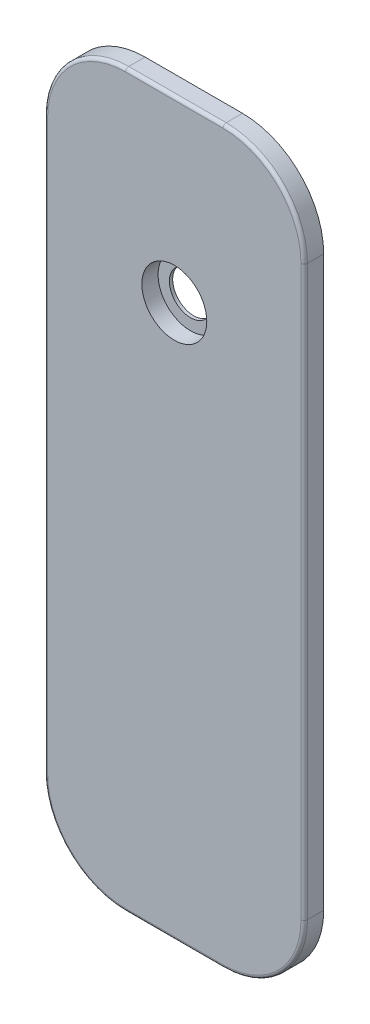
ISO-10303-21;
HEADER;
FILE_DESCRIPTION(('STEP AP214'),'2;1');
FILE_NAME('part.step','',(''),(''),'','','');
FILE_SCHEMA(('AUTOMOTIVE_DESIGN { 1 0 10303 214 1 1 1 1 }'));
ENDSEC;
DATA;
#1=APPLICATION_CONTEXT('core data for automotive mechanical design processes');
#2=APPLICATION_PROTOCOL_DEFINITION('international standard','automotive_design',2000,#1);
#3=PRODUCT_CONTEXT('',#1,'mechanical');
#4=PRODUCT('Part','Part','',(#3));
#5=PRODUCT_RELATED_PRODUCT_CATEGORY('part','',(#4));
#6=PRODUCT_DEFINITION_FORMATION('','',#4);
#7=PRODUCT_DEFINITION_CONTEXT('part definition',#1,'design');
#8=PRODUCT_DEFINITION('design','',#6,#7);
#9=PRODUCT_DEFINITION_SHAPE('','',#8);
#10=(LENGTH_UNIT() NAMED_UNIT(*) SI_UNIT(.MILLI.,.METRE.));
#11=(NAMED_UNIT(*) PLANE_ANGLE_UNIT() SI_UNIT($,.RADIAN.));
#12=(NAMED_UNIT(*) SI_UNIT($,.STERADIAN.) SOLID_ANGLE_UNIT());
#13=UNCERTAINTY_MEASURE_WITH_UNIT(LENGTH_MEASURE(1.E-05),#10,'distance_accuracy_value','');
#14=(GEOMETRIC_REPRESENTATION_CONTEXT(3) GLOBAL_UNCERTAINTY_ASSIGNED_CONTEXT((#13)) GLOBAL_UNIT_ASSIGNED_CONTEXT((#10,
#11,#12)) REPRESENTATION_CONTEXT('',''));
#15=CARTESIAN_POINT('',(0.,0.,0.));
#16=DIRECTION('',(0.,0.,1.));
#17=DIRECTION('',(1.,0.,0.));
#18=AXIS2_PLACEMENT_3D('',#15,#16,#17);
#19=CARTESIAN_POINT('',(0.,57.5,6.));
#20=DIRECTION('',(0.,0.,-1.));
#21=DIRECTION('',(-1.,0.,0.));
#22=AXIS2_PLACEMENT_3D('',#19,#20,#21);
#23=CYLINDRICAL_SURFACE('',#22,6.5);
#24=CARTESIAN_POINT('',(0.,57.5,0.));
#25=DIRECTION('',(0.,0.,1.));
#26=DIRECTION('',(1.,0.,0.));
#27=AXIS2_PLACEMENT_3D('',#24,#25,#26);
#28=CIRCLE('',#27,6.5);
#29=CARTESIAN_POINT('',(6.50000000000001,57.5,0.));
#30=VERTEX_POINT('',#29);
#31=EDGE_CURVE('E152',#30,#30,#28,.T.);
#32=ORIENTED_EDGE('',*,*,#31,.F.);
#33=EDGE_LOOP('',(#32));
#34=FACE_BOUND('',#33,.T.);
#35=CARTESIAN_POINT('',(0.,57.5,1.));
#36=DIRECTION('',(0.,0.,1.));
#37=DIRECTION('',(1.,0.,0.));
#38=AXIS2_PLACEMENT_3D('',#35,#36,#37);
#39=CIRCLE('',#38,6.5);
#40=CARTESIAN_POINT('',(6.50000000000001,57.5,1.));
#41=VERTEX_POINT('',#40);
#42=EDGE_CURVE('E38',#41,#41,#39,.T.);
#43=ORIENTED_EDGE('',*,*,#42,.T.);
#44=EDGE_LOOP('',(#43));
#45=FACE_BOUND('',#44,.T.);
#46=ADVANCED_FACE('F34',(#34,#45),#23,.F.);
#47=CARTESIAN_POINT('',(-15.,-87.5,6.));
#48=DIRECTION('',(0.,0.,-1.));
#49=DIRECTION('',(-1.,0.,0.));
#50=AXIS2_PLACEMENT_3D('',#47,#48,#49);
#51=PLANE('',#50);
#52=CARTESIAN_POINT('',(0.,57.5,6.));
#53=DIRECTION('',(0.,0.,1.));
#54=DIRECTION('',(1.,0.,0.));
#55=AXIS2_PLACEMENT_3D('',#52,#53,#54);
#56=CIRCLE('',#55,10.);
#57=CARTESIAN_POINT('',(10.,57.5,6.));
#58=VERTEX_POINT('',#57);
#59=EDGE_CURVE('E465',#58,#58,#56,.T.);
#60=ORIENTED_EDGE('',*,*,#59,.F.);
#61=EDGE_LOOP('',(#60));
#62=FACE_BOUND('',#61,.T.);
#63=DIRECTION('',(1.,0.,0.));
#64=VECTOR('',#63,1.);
#65=CARTESIAN_POINT('',(-15.,-111.5,6.));
#66=LINE('',#65,#64);
#67=CARTESIAN_POINT('',(-15.,-111.5,6.));
#68=VERTEX_POINT('',#67);
#69=CARTESIAN_POINT('',(15.,-111.5,6.));
#70=VERTEX_POINT('',#69);
#71=EDGE_CURVE('E197',#68,#70,#66,.T.);
#72=ORIENTED_EDGE('',*,*,#71,.T.);
#73=CARTESIAN_POINT('',(15.,-87.5,6.));
#74=DIRECTION('',(0.,0.,-1.));
#75=DIRECTION('',(-1.,0.,0.));
#76=AXIS2_PLACEMENT_3D('',#73,#74,#75);
#77=CIRCLE('',#76,24.);
#78=CARTESIAN_POINT('',(39.,-87.5,6.));
#79=VERTEX_POINT('',#78);
#80=EDGE_CURVE('E199',#70,#79,#77,.F.);
#81=ORIENTED_EDGE('',*,*,#80,.T.);
#82=DIRECTION('',(0.,1.,0.));
#83=VECTOR('',#82,1.);
#84=CARTESIAN_POINT('',(39.,-87.5,6.));
#85=LINE('',#84,#83);
#86=CARTESIAN_POINT('',(39.,87.5,6.));
#87=VERTEX_POINT('',#86);
#88=EDGE_CURVE('E135',#79,#87,#85,.T.);
#89=ORIENTED_EDGE('',*,*,#88,.T.);
#90=CARTESIAN_POINT('',(15.,87.5,6.));
#91=DIRECTION('',(0.,0.,-1.));
#92=DIRECTION('',(-1.,0.,0.));
#93=AXIS2_PLACEMENT_3D('',#90,#91,#92);
#94=CIRCLE('',#93,24.);
#95=CARTESIAN_POINT('',(15.,111.5,6.));
#96=VERTEX_POINT('',#95);
#97=EDGE_CURVE('E187',#87,#96,#94,.F.);
#98=ORIENTED_EDGE('',*,*,#97,.T.);
#99=DIRECTION('',(-1.,0.,0.));
#100=VECTOR('',#99,1.);
#101=CARTESIAN_POINT('',(-15.,111.5,6.));
#102=LINE('',#101,#100);
#103=CARTESIAN_POINT('',(-15.,111.5,6.));
#104=VERTEX_POINT('',#103);
#105=EDGE_CURVE('E189',#96,#104,#102,.T.);
#106=ORIENTED_EDGE('',*,*,#105,.T.);
#107=CARTESIAN_POINT('',(-15.,87.5,6.));
#108=DIRECTION('',(0.,0.,-1.));
#109=DIRECTION('',(-1.,0.,0.));
#110=AXIS2_PLACEMENT_3D('',#107,#108,#109);
#111=CIRCLE('',#110,24.);
#112=CARTESIAN_POINT('',(-39.,87.5,6.));
#113=VERTEX_POINT('',#112);
#114=EDGE_CURVE('E191',#104,#113,#111,.F.);
#115=ORIENTED_EDGE('',*,*,#114,.T.);
#116=DIRECTION('',(0.,-1.,0.));
#117=VECTOR('',#116,1.);
#118=CARTESIAN_POINT('',(-39.,-87.5,6.));
#119=LINE('',#118,#117);
#120=CARTESIAN_POINT('',(-39.,-87.5,6.));
#121=VERTEX_POINT('',#120);
#122=EDGE_CURVE('E193',#113,#121,#119,.T.);
#123=ORIENTED_EDGE('',*,*,#122,.T.);
#124=CARTESIAN_POINT('',(-15.,-87.5,6.));
#125=DIRECTION('',(0.,0.,-1.));
#126=DIRECTION('',(-1.,0.,0.));
#127=AXIS2_PLACEMENT_3D('',#124,#125,#126);
#128=CIRCLE('',#127,24.);
#129=EDGE_CURVE('E195',#121,#68,#128,.F.);
#130=ORIENTED_EDGE('',*,*,#129,.T.);
#131=EDGE_LOOP('',(#72,#81,#89,#98,#106,#115,#123,#130));
#132=FACE_BOUND('',#131,.T.);
#133=ADVANCED_FACE('F261',(#62,#132),#51,.F.);
#134=CARTESIAN_POINT('',(-15.,-87.5,0.));
#135=DIRECTION('',(0.,0.,-1.));
#136=DIRECTION('',(-1.,0.,0.));
#137=AXIS2_PLACEMENT_3D('',#134,#135,#136);
#138=PLANE('',#137);
#139=CARTESIAN_POINT('',(-15.,-87.5,0.));
#140=DIRECTION('',(0.,0.,1.));
#141=DIRECTION('',(-1.,0.,0.));
#142=AXIS2_PLACEMENT_3D('',#139,#140,#141);
#143=CIRCLE('',#142,25.);
#144=CARTESIAN_POINT('',(-40.,-87.5,0.));
#145=VERTEX_POINT('',#144);
#146=CARTESIAN_POINT('',(-15.,-112.5,0.));
#147=VERTEX_POINT('',#146);
#148=EDGE_CURVE('E143',#145,#147,#143,.T.);
#149=ORIENTED_EDGE('',*,*,#148,.F.);
#150=DIRECTION('',(0.,-1.,0.));
#151=VECTOR('',#150,1.);
#152=CARTESIAN_POINT('',(-40.,87.5,0.));
#153=LINE('',#152,#151);
#154=CARTESIAN_POINT('',(-40.,87.5,0.));
#155=VERTEX_POINT('',#154);
#156=EDGE_CURVE('E172',#155,#145,#153,.T.);
#157=ORIENTED_EDGE('',*,*,#156,.F.);
#158=CARTESIAN_POINT('',(-15.,87.5,0.));
#159=DIRECTION('',(0.,0.,1.));
#160=DIRECTION('',(1.,0.,0.));
#161=AXIS2_PLACEMENT_3D('',#158,#159,#160);
#162=CIRCLE('',#161,25.);
#163=CARTESIAN_POINT('',(-15.,112.5,0.));
#164=VERTEX_POINT('',#163);
#165=EDGE_CURVE('E169',#164,#155,#162,.T.);
#166=ORIENTED_EDGE('',*,*,#165,.F.);
#167=DIRECTION('',(-1.,0.,0.));
#168=VECTOR('',#167,1.);
#169=CARTESIAN_POINT('',(15.,112.5,0.));
#170=LINE('',#169,#168);
#171=CARTESIAN_POINT('',(15.,112.5,0.));
#172=VERTEX_POINT('',#171);
#173=EDGE_CURVE('E166',#172,#164,#170,.T.);
#174=ORIENTED_EDGE('',*,*,#173,.F.);
#175=CARTESIAN_POINT('',(15.,87.5,0.));
#176=DIRECTION('',(0.,0.,1.));
#177=DIRECTION('',(-1.,0.,0.));
#178=AXIS2_PLACEMENT_3D('',#175,#176,#177);
#179=CIRCLE('',#178,25.);
#180=CARTESIAN_POINT('',(40.,87.5,0.));
#181=VERTEX_POINT('',#180);
#182=EDGE_CURVE('E163',#181,#172,#179,.T.);
#183=ORIENTED_EDGE('',*,*,#182,.F.);
#184=DIRECTION('',(0.,1.,0.));
#185=VECTOR('',#184,1.);
#186=CARTESIAN_POINT('',(40.,87.5,0.));
#187=LINE('',#186,#185);
#188=CARTESIAN_POINT('',(40.,-87.5,0.));
#189=VERTEX_POINT('',#188);
#190=EDGE_CURVE('E160',#189,#181,#187,.T.);
#191=ORIENTED_EDGE('',*,*,#190,.F.);
#192=CARTESIAN_POINT('',(15.,-87.5,0.));
#193=DIRECTION('',(0.,0.,1.));
#194=DIRECTION('',(-1.,0.,0.));
#195=AXIS2_PLACEMENT_3D('',#192,#193,#194);
#196=CIRCLE('',#195,25.);
#197=CARTESIAN_POINT('',(15.,-112.5,0.));
#198=VERTEX_POINT('',#197);
#199=EDGE_CURVE('E146',#198,#189,#196,.T.);
#200=ORIENTED_EDGE('',*,*,#199,.F.);
#201=DIRECTION('',(1.,0.,0.));
#202=VECTOR('',#201,1.);
#203=CARTESIAN_POINT('',(15.,-112.5,0.));
#204=LINE('',#203,#202);
#205=EDGE_CURVE('E128',#147,#198,#204,.T.);
#206=ORIENTED_EDGE('',*,*,#205,.F.);
#207=EDGE_LOOP('',(#149,#157,#166,#174,#183,#191,#200,#206));
#208=FACE_BOUND('',#207,.T.);
#209=ORIENTED_EDGE('',*,*,#31,.T.);
#210=EDGE_LOOP('',(#209));
#211=FACE_BOUND('',#210,.T.);
#212=ADVANCED_FACE('F140',(#208,#211),#138,.T.);
#213=CARTESIAN_POINT('',(-15.,-87.5,6.));
#214=DIRECTION('',(0.,0.,-1.));
#215=DIRECTION('',(-1.,0.,0.));
#216=AXIS2_PLACEMENT_3D('',#213,#214,#215);
#217=CYLINDRICAL_SURFACE('',#216,25.);
#218=DIRECTION('',(0.,0.,-1.));
#219=VECTOR('',#218,1.);
#220=CARTESIAN_POINT('',(-15.,-112.5,6.));
#221=LINE('',#220,#219);
#222=CARTESIAN_POINT('',(-15.,-112.5,5.));
#223=VERTEX_POINT('',#222);
#224=EDGE_CURVE('E124',#223,#147,#221,.T.);
#225=ORIENTED_EDGE('',*,*,#224,.F.);
#226=CARTESIAN_POINT('',(-15.,-87.5,5.));
#227=DIRECTION('',(0.,0.,-1.));
#228=DIRECTION('',(-1.,0.,0.));
#229=AXIS2_PLACEMENT_3D('',#226,#227,#228);
#230=CIRCLE('',#229,25.);
#231=CARTESIAN_POINT('',(-40.,-87.5,5.));
#232=VERTEX_POINT('',#231);
#233=EDGE_CURVE('E206',#223,#232,#230,.T.);
#234=ORIENTED_EDGE('',*,*,#233,.T.);
#235=DIRECTION('',(0.,0.,-1.));
#236=VECTOR('',#235,1.);
#237=CARTESIAN_POINT('',(-40.,-87.5,6.));
#238=LINE('',#237,#236);
#239=EDGE_CURVE('E150',#232,#145,#238,.T.);
#240=ORIENTED_EDGE('',*,*,#239,.T.);
#241=ORIENTED_EDGE('',*,*,#148,.T.);
#242=EDGE_LOOP('',(#225,#234,#240,#241));
#243=FACE_BOUND('',#242,.T.);
#244=ADVANCED_FACE('F148',(#243),#217,.T.);
#245=CARTESIAN_POINT('',(15.,-112.5,6.));
#246=DIRECTION('',(0.,1.,0.));
#247=DIRECTION('',(0.,0.,1.));
#248=AXIS2_PLACEMENT_3D('',#245,#246,#247);
#249=PLANE('',#248);
#250=DIRECTION('',(0.,0.,-1.));
#251=VECTOR('',#250,1.);
#252=CARTESIAN_POINT('',(15.,-112.5,6.));
#253=LINE('',#252,#251);
#254=CARTESIAN_POINT('',(15.,-112.5,5.));
#255=VERTEX_POINT('',#254);
#256=EDGE_CURVE('E136',#255,#198,#253,.T.);
#257=ORIENTED_EDGE('',*,*,#256,.F.);
#258=DIRECTION('',(1.,0.,0.));
#259=VECTOR('',#258,1.);
#260=CARTESIAN_POINT('',(15.,-112.5,5.));
#261=LINE('',#260,#259);
#262=EDGE_CURVE('E131',#255,#223,#261,.F.);
#263=ORIENTED_EDGE('',*,*,#262,.T.);
#264=ORIENTED_EDGE('',*,*,#224,.T.);
#265=ORIENTED_EDGE('',*,*,#205,.T.);
#266=EDGE_LOOP('',(#257,#263,#264,#265));
#267=FACE_BOUND('',#266,.T.);
#268=ADVANCED_FACE('F127',(#267),#249,.F.);
#269=CARTESIAN_POINT('',(15.,-87.5,6.));
#270=DIRECTION('',(0.,0.,-1.));
#271=DIRECTION('',(-1.,0.,0.));
#272=AXIS2_PLACEMENT_3D('',#269,#270,#271);
#273=CYLINDRICAL_SURFACE('',#272,25.);
#274=DIRECTION('',(0.,0.,-1.));
#275=VECTOR('',#274,1.);
#276=CARTESIAN_POINT('',(40.,-87.5,6.));
#277=LINE('',#276,#275);
#278=CARTESIAN_POINT('',(40.,-87.5,5.));
#279=VERTEX_POINT('',#278);
#280=EDGE_CURVE('E183',#279,#189,#277,.T.);
#281=ORIENTED_EDGE('',*,*,#280,.F.);
#282=CARTESIAN_POINT('',(15.,-87.5,5.));
#283=DIRECTION('',(0.,0.,-1.));
#284=DIRECTION('',(-1.,0.,0.));
#285=AXIS2_PLACEMENT_3D('',#282,#283,#284);
#286=CIRCLE('',#285,25.);
#287=EDGE_CURVE('E202',#279,#255,#286,.T.);
#288=ORIENTED_EDGE('',*,*,#287,.T.);
#289=ORIENTED_EDGE('',*,*,#256,.T.);
#290=ORIENTED_EDGE('',*,*,#199,.T.);
#291=EDGE_LOOP('',(#281,#288,#289,#290));
#292=FACE_BOUND('',#291,.T.);
#293=ADVANCED_FACE('F282',(#292),#273,.T.);
#294=CARTESIAN_POINT('',(40.,87.5,6.));
#295=DIRECTION('',(-1.,0.,0.));
#296=DIRECTION('',(0.,0.,1.));
#297=AXIS2_PLACEMENT_3D('',#294,#295,#296);
#298=PLANE('',#297);
#299=DIRECTION('',(0.,0.,-1.));
#300=VECTOR('',#299,1.);
#301=CARTESIAN_POINT('',(40.,87.5,6.));
#302=LINE('',#301,#300);
#303=CARTESIAN_POINT('',(40.,87.5,5.));
#304=VERTEX_POINT('',#303);
#305=EDGE_CURVE('E181',#304,#181,#302,.T.);
#306=ORIENTED_EDGE('',*,*,#305,.F.);
#307=DIRECTION('',(0.,1.,0.));
#308=VECTOR('',#307,1.);
#309=CARTESIAN_POINT('',(40.,87.5,5.));
#310=LINE('',#309,#308);
#311=EDGE_CURVE('E11',#304,#279,#310,.F.);
#312=ORIENTED_EDGE('',*,*,#311,.T.);
#313=ORIENTED_EDGE('',*,*,#280,.T.);
#314=ORIENTED_EDGE('',*,*,#190,.T.);
#315=EDGE_LOOP('',(#306,#312,#313,#314));
#316=FACE_BOUND('',#315,.T.);
#317=ADVANCED_FACE('F403',(#316),#298,.F.);
#318=CARTESIAN_POINT('',(15.,87.5,6.));
#319=DIRECTION('',(0.,0.,-1.));
#320=DIRECTION('',(-1.,0.,0.));
#321=AXIS2_PLACEMENT_3D('',#318,#319,#320);
#322=CYLINDRICAL_SURFACE('',#321,25.);
#323=DIRECTION('',(0.,0.,-1.));
#324=VECTOR('',#323,1.);
#325=CARTESIAN_POINT('',(15.,112.5,6.));
#326=LINE('',#325,#324);
#327=CARTESIAN_POINT('',(15.,112.5,5.));
#328=VERTEX_POINT('',#327);
#329=EDGE_CURVE('E179',#328,#172,#326,.T.);
#330=ORIENTED_EDGE('',*,*,#329,.F.);
#331=CARTESIAN_POINT('',(15.,87.5,5.));
#332=DIRECTION('',(0.,0.,-1.));
#333=DIRECTION('',(-1.,0.,0.));
#334=AXIS2_PLACEMENT_3D('',#331,#332,#333);
#335=CIRCLE('',#334,25.);
#336=EDGE_CURVE('E43',#328,#304,#335,.T.);
#337=ORIENTED_EDGE('',*,*,#336,.T.);
#338=ORIENTED_EDGE('',*,*,#305,.T.);
#339=ORIENTED_EDGE('',*,*,#182,.T.);
#340=EDGE_LOOP('',(#330,#337,#338,#339));
#341=FACE_BOUND('',#340,.T.);
#342=ADVANCED_FACE('F395',(#341),#322,.T.);
#343=CARTESIAN_POINT('',(15.,112.5,6.));
#344=DIRECTION('',(0.,-1.,0.));
#345=DIRECTION('',(0.,0.,-1.));
#346=AXIS2_PLACEMENT_3D('',#343,#344,#345);
#347=PLANE('',#346);
#348=DIRECTION('',(0.,0.,-1.));
#349=VECTOR('',#348,1.);
#350=CARTESIAN_POINT('',(-15.,112.5,6.));
#351=LINE('',#350,#349);
#352=CARTESIAN_POINT('',(-15.,112.5,5.));
#353=VERTEX_POINT('',#352);
#354=EDGE_CURVE('E177',#353,#164,#351,.T.);
#355=ORIENTED_EDGE('',*,*,#354,.F.);
#356=DIRECTION('',(-1.,0.,0.));
#357=VECTOR('',#356,1.);
#358=CARTESIAN_POINT('',(15.,112.5,5.));
#359=LINE('',#358,#357);
#360=EDGE_CURVE('E58',#353,#328,#359,.F.);
#361=ORIENTED_EDGE('',*,*,#360,.T.);
#362=ORIENTED_EDGE('',*,*,#329,.T.);
#363=ORIENTED_EDGE('',*,*,#173,.T.);
#364=EDGE_LOOP('',(#355,#361,#362,#363));
#365=FACE_BOUND('',#364,.T.);
#366=ADVANCED_FACE('F246',(#365),#347,.F.);
#367=CARTESIAN_POINT('',(-15.,87.5,6.));
#368=DIRECTION('',(0.,0.,-1.));
#369=DIRECTION('',(-1.,0.,0.));
#370=AXIS2_PLACEMENT_3D('',#367,#368,#369);
#371=CYLINDRICAL_SURFACE('',#370,25.);
#372=DIRECTION('',(0.,0.,-1.));
#373=VECTOR('',#372,1.);
#374=CARTESIAN_POINT('',(-40.,87.5,6.));
#375=LINE('',#374,#373);
#376=CARTESIAN_POINT('',(-40.,87.5,5.));
#377=VERTEX_POINT('',#376);
#378=EDGE_CURVE('E175',#377,#155,#375,.T.);
#379=ORIENTED_EDGE('',*,*,#378,.F.);
#380=CARTESIAN_POINT('',(-15.,87.5,5.));
#381=DIRECTION('',(0.,0.,-1.));
#382=DIRECTION('',(-1.,0.,0.));
#383=AXIS2_PLACEMENT_3D('',#380,#381,#382);
#384=CIRCLE('',#383,25.);
#385=EDGE_CURVE('E210',#377,#353,#384,.T.);
#386=ORIENTED_EDGE('',*,*,#385,.T.);
#387=ORIENTED_EDGE('',*,*,#354,.T.);
#388=ORIENTED_EDGE('',*,*,#165,.T.);
#389=EDGE_LOOP('',(#379,#386,#387,#388));
#390=FACE_BOUND('',#389,.T.);
#391=ADVANCED_FACE('F245',(#390),#371,.T.);
#392=CARTESIAN_POINT('',(-40.,87.5,6.));
#393=DIRECTION('',(1.,0.,0.));
#394=DIRECTION('',(0.,0.,-1.));
#395=AXIS2_PLACEMENT_3D('',#392,#393,#394);
#396=PLANE('',#395);
#397=ORIENTED_EDGE('',*,*,#239,.F.);
#398=DIRECTION('',(0.,-1.,0.));
#399=VECTOR('',#398,1.);
#400=CARTESIAN_POINT('',(-40.,87.5,5.));
#401=LINE('',#400,#399);
#402=EDGE_CURVE('E208',#232,#377,#401,.F.);
#403=ORIENTED_EDGE('',*,*,#402,.T.);
#404=ORIENTED_EDGE('',*,*,#378,.T.);
#405=ORIENTED_EDGE('',*,*,#156,.T.);
#406=EDGE_LOOP('',(#397,#403,#404,#405));
#407=FACE_BOUND('',#406,.T.);
#408=ADVANCED_FACE('F251',(#407),#396,.F.);
#409=CARTESIAN_POINT('',(-15.,87.5,5.));
#410=DIRECTION('',(0.,0.,-1.));
#411=DIRECTION('',(-1.,0.,0.));
#412=AXIS2_PLACEMENT_3D('',#409,#410,#411);
#413=TOROIDAL_SURFACE('',#412,24.,1.);
#414=CARTESIAN_POINT('',(-15.,111.5,5.));
#415=DIRECTION('',(1.,0.,0.));
#416=DIRECTION('',(0.,0.,-1.));
#417=AXIS2_PLACEMENT_3D('',#414,#415,#416);
#418=CIRCLE('',#417,1.);
#419=EDGE_CURVE('E230',#353,#104,#418,.T.);
#420=ORIENTED_EDGE('',*,*,#419,.F.);
#421=ORIENTED_EDGE('',*,*,#385,.F.);
#422=CARTESIAN_POINT('',(-39.,87.5,5.));
#423=DIRECTION('',(0.,-1.,0.));
#424=DIRECTION('',(0.,0.,-1.));
#425=AXIS2_PLACEMENT_3D('',#422,#423,#424);
#426=CIRCLE('',#425,1.);
#427=EDGE_CURVE('E155',#113,#377,#426,.T.);
#428=ORIENTED_EDGE('',*,*,#427,.F.);
#429=ORIENTED_EDGE('',*,*,#114,.F.);
#430=EDGE_LOOP('',(#420,#421,#428,#429));
#431=FACE_BOUND('',#430,.T.);
#432=ADVANCED_FACE('F36',(#431),#413,.T.);
#433=CARTESIAN_POINT('',(-39.,-87.5,5.));
#434=DIRECTION('',(0.,-1.,0.));
#435=DIRECTION('',(0.,0.,-1.));
#436=AXIS2_PLACEMENT_3D('',#433,#434,#435);
#437=CYLINDRICAL_SURFACE('',#436,1.);
#438=ORIENTED_EDGE('',*,*,#427,.T.);
#439=ORIENTED_EDGE('',*,*,#402,.F.);
#440=CARTESIAN_POINT('',(-39.,-87.5,5.));
#441=DIRECTION('',(0.,-1.,0.));
#442=DIRECTION('',(0.,0.,-1.));
#443=AXIS2_PLACEMENT_3D('',#440,#441,#442);
#444=CIRCLE('',#443,1.);
#445=EDGE_CURVE('E227',#121,#232,#444,.T.);
#446=ORIENTED_EDGE('',*,*,#445,.F.);
#447=ORIENTED_EDGE('',*,*,#122,.F.);
#448=EDGE_LOOP('',(#438,#439,#446,#447));
#449=FACE_BOUND('',#448,.T.);
#450=ADVANCED_FACE('F237',(#449),#437,.T.);
#451=CARTESIAN_POINT('',(-15.,111.5,5.));
#452=DIRECTION('',(-1.,0.,0.));
#453=DIRECTION('',(0.,0.,1.));
#454=AXIS2_PLACEMENT_3D('',#451,#452,#453);
#455=CYLINDRICAL_SURFACE('',#454,1.);
#456=ORIENTED_EDGE('',*,*,#419,.T.);
#457=ORIENTED_EDGE('',*,*,#105,.F.);
#458=CARTESIAN_POINT('',(15.,111.5,5.));
#459=DIRECTION('',(1.,0.,0.));
#460=DIRECTION('',(0.,0.,-1.));
#461=AXIS2_PLACEMENT_3D('',#458,#459,#460);
#462=CIRCLE('',#461,1.);
#463=EDGE_CURVE('E224',#328,#96,#462,.T.);
#464=ORIENTED_EDGE('',*,*,#463,.F.);
#465=ORIENTED_EDGE('',*,*,#360,.F.);
#466=EDGE_LOOP('',(#456,#457,#464,#465));
#467=FACE_BOUND('',#466,.T.);
#468=ADVANCED_FACE('F305',(#467),#455,.T.);
#469=CARTESIAN_POINT('',(-15.,-87.5,5.));
#470=DIRECTION('',(0.,0.,-1.));
#471=DIRECTION('',(-1.,0.,0.));
#472=AXIS2_PLACEMENT_3D('',#469,#470,#471);
#473=TOROIDAL_SURFACE('',#472,24.,1.);
#474=ORIENTED_EDGE('',*,*,#445,.T.);
#475=ORIENTED_EDGE('',*,*,#233,.F.);
#476=CARTESIAN_POINT('',(-15.,-111.5,5.));
#477=DIRECTION('',(1.,0.,0.));
#478=DIRECTION('',(0.,0.,-1.));
#479=AXIS2_PLACEMENT_3D('',#476,#477,#478);
#480=CIRCLE('',#479,1.);
#481=EDGE_CURVE('E221',#68,#223,#480,.T.);
#482=ORIENTED_EDGE('',*,*,#481,.F.);
#483=ORIENTED_EDGE('',*,*,#129,.F.);
#484=EDGE_LOOP('',(#474,#475,#482,#483));
#485=FACE_BOUND('',#484,.T.);
#486=ADVANCED_FACE('F301',(#485),#473,.T.);
#487=CARTESIAN_POINT('',(15.,87.5,5.));
#488=DIRECTION('',(0.,0.,-1.));
#489=DIRECTION('',(-1.,0.,0.));
#490=AXIS2_PLACEMENT_3D('',#487,#488,#489);
#491=TOROIDAL_SURFACE('',#490,24.,1.);
#492=ORIENTED_EDGE('',*,*,#463,.T.);
#493=ORIENTED_EDGE('',*,*,#97,.F.);
#494=CARTESIAN_POINT('',(39.,87.5,5.));
#495=DIRECTION('',(0.,-1.,0.));
#496=DIRECTION('',(0.,0.,-1.));
#497=AXIS2_PLACEMENT_3D('',#494,#495,#496);
#498=CIRCLE('',#497,1.);
#499=EDGE_CURVE('E218',#304,#87,#498,.T.);
#500=ORIENTED_EDGE('',*,*,#499,.F.);
#501=ORIENTED_EDGE('',*,*,#336,.F.);
#502=EDGE_LOOP('',(#492,#493,#500,#501));
#503=FACE_BOUND('',#502,.T.);
#504=ADVANCED_FACE('F297',(#503),#491,.T.);
#505=CARTESIAN_POINT('',(-15.,-111.5,5.));
#506=DIRECTION('',(1.,0.,0.));
#507=DIRECTION('',(0.,0.,-1.));
#508=AXIS2_PLACEMENT_3D('',#505,#506,#507);
#509=CYLINDRICAL_SURFACE('',#508,1.);
#510=ORIENTED_EDGE('',*,*,#481,.T.);
#511=ORIENTED_EDGE('',*,*,#262,.F.);
#512=CARTESIAN_POINT('',(15.,-111.5,5.));
#513=DIRECTION('',(1.,0.,0.));
#514=DIRECTION('',(0.,0.,-1.));
#515=AXIS2_PLACEMENT_3D('',#512,#513,#514);
#516=CIRCLE('',#515,1.);
#517=EDGE_CURVE('E216',#70,#255,#516,.T.);
#518=ORIENTED_EDGE('',*,*,#517,.F.);
#519=ORIENTED_EDGE('',*,*,#71,.F.);
#520=EDGE_LOOP('',(#510,#511,#518,#519));
#521=FACE_BOUND('',#520,.T.);
#522=ADVANCED_FACE('F293',(#521),#509,.T.);
#523=CARTESIAN_POINT('',(39.,-87.5,5.));
#524=DIRECTION('',(0.,1.,0.));
#525=DIRECTION('',(0.,0.,1.));
#526=AXIS2_PLACEMENT_3D('',#523,#524,#525);
#527=CYLINDRICAL_SURFACE('',#526,1.);
#528=ORIENTED_EDGE('',*,*,#499,.T.);
#529=ORIENTED_EDGE('',*,*,#88,.F.);
#530=CARTESIAN_POINT('',(39.,-87.5,5.));
#531=DIRECTION('',(0.,-1.,0.));
#532=DIRECTION('',(0.,0.,-1.));
#533=AXIS2_PLACEMENT_3D('',#530,#531,#532);
#534=CIRCLE('',#533,1.);
#535=EDGE_CURVE('E214',#279,#79,#534,.T.);
#536=ORIENTED_EDGE('',*,*,#535,.F.);
#537=ORIENTED_EDGE('',*,*,#311,.F.);
#538=EDGE_LOOP('',(#528,#529,#536,#537));
#539=FACE_BOUND('',#538,.T.);
#540=ADVANCED_FACE('F289',(#539),#527,.T.);
#541=CARTESIAN_POINT('',(15.,-87.5,5.));
#542=DIRECTION('',(0.,0.,-1.));
#543=DIRECTION('',(-1.,0.,0.));
#544=AXIS2_PLACEMENT_3D('',#541,#542,#543);
#545=TOROIDAL_SURFACE('',#544,24.,1.);
#546=ORIENTED_EDGE('',*,*,#517,.T.);
#547=ORIENTED_EDGE('',*,*,#287,.F.);
#548=ORIENTED_EDGE('',*,*,#535,.T.);
#549=ORIENTED_EDGE('',*,*,#80,.F.);
#550=EDGE_LOOP('',(#546,#547,#548,#549));
#551=FACE_BOUND('',#550,.T.);
#552=ADVANCED_FACE('F286',(#551),#545,.T.);
#553=CARTESIAN_POINT('',(0.,57.5,1.));
#554=DIRECTION('',(0.,0.,1.));
#555=DIRECTION('',(1.,0.,0.));
#556=AXIS2_PLACEMENT_3D('',#553,#554,#555);
#557=CYLINDRICAL_SURFACE('',#556,10.);
#558=CARTESIAN_POINT('',(0.,57.5,1.));
#559=DIRECTION('',(0.,0.,1.));
#560=DIRECTION('',(1.,0.,0.));
#561=AXIS2_PLACEMENT_3D('',#558,#559,#560);
#562=CIRCLE('',#561,10.);
#563=CARTESIAN_POINT('',(10.,57.5,1.));
#564=VERTEX_POINT('',#563);
#565=EDGE_CURVE('E464',#564,#564,#562,.T.);
#566=ORIENTED_EDGE('',*,*,#565,.F.);
#567=EDGE_LOOP('',(#566));
#568=FACE_BOUND('',#567,.T.);
#569=ORIENTED_EDGE('',*,*,#59,.T.);
#570=EDGE_LOOP('',(#569));
#571=FACE_BOUND('',#570,.T.);
#572=ADVANCED_FACE('F272',(#568,#571),#557,.F.);
#573=CARTESIAN_POINT('',(0.,57.5,1.));
#574=DIRECTION('',(0.,0.,1.));
#575=DIRECTION('',(1.,0.,0.));
#576=AXIS2_PLACEMENT_3D('',#573,#574,#575);
#577=PLANE('',#576);
#578=ORIENTED_EDGE('',*,*,#42,.F.);
#579=EDGE_LOOP('',(#578));
#580=FACE_BOUND('',#579,.T.);
#581=ORIENTED_EDGE('',*,*,#565,.T.);
#582=EDGE_LOOP('',(#581));
#583=FACE_BOUND('',#582,.T.);
#584=ADVANCED_FACE('F344',(#580,#583),#577,.T.);
#585=CLOSED_SHELL('',(#46,#133,#212,#244,#268,#293,#317,#342,#366,#391,#408,#432,#450,#468,#486,
#504,#522,#540,#552,#572,#584));
#586=MANIFOLD_SOLID_BREP('B2',#585);
#587=ADVANCED_BREP_SHAPE_REPRESENTATION('',(#18,#586),#14);
#588=SHAPE_DEFINITION_REPRESENTATION(#9,#587);
ENDSEC;
END-ISO-10303-21;
